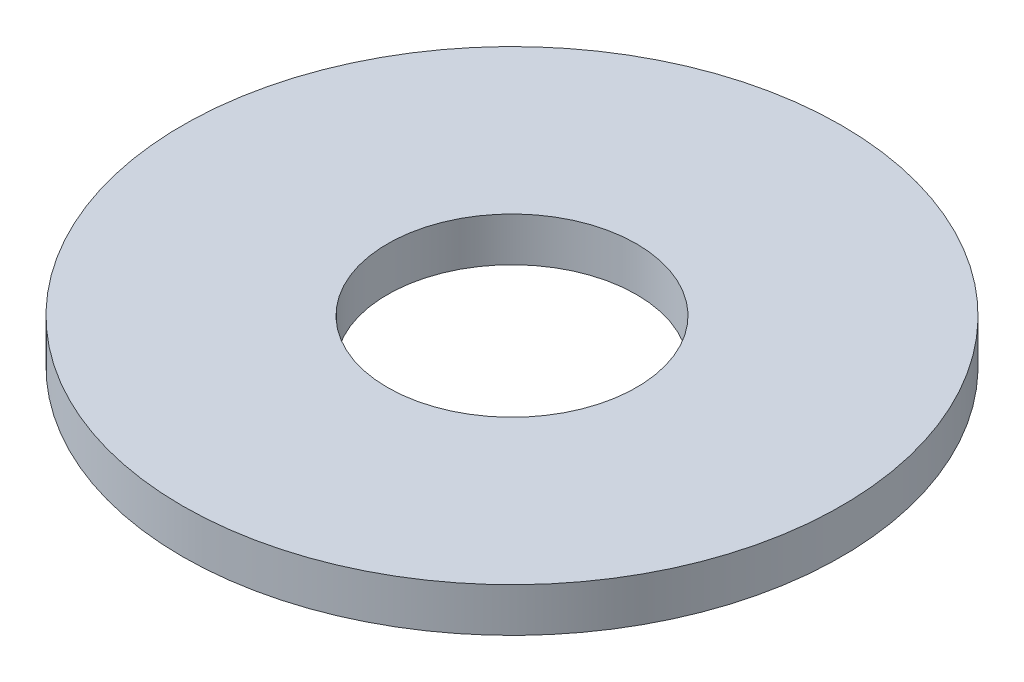
ISO-10303-21;
HEADER;
FILE_DESCRIPTION(('STEP AP214'),'2;1');
FILE_NAME('part.step','',(''),(''),'','','');
FILE_SCHEMA(('AUTOMOTIVE_DESIGN { 1 0 10303 214 1 1 1 1 }'));
ENDSEC;
DATA;
#1=APPLICATION_CONTEXT('core data for automotive mechanical design processes');
#2=APPLICATION_PROTOCOL_DEFINITION('international standard','automotive_design',2000,#1);
#3=PRODUCT_CONTEXT('',#1,'mechanical');
#4=PRODUCT('Part','Part','',(#3));
#5=PRODUCT_RELATED_PRODUCT_CATEGORY('part','',(#4));
#6=PRODUCT_DEFINITION_FORMATION('','',#4);
#7=PRODUCT_DEFINITION_CONTEXT('part definition',#1,'design');
#8=PRODUCT_DEFINITION('design','',#6,#7);
#9=PRODUCT_DEFINITION_SHAPE('','',#8);
#10=(LENGTH_UNIT() NAMED_UNIT(*) SI_UNIT(.MILLI.,.METRE.));
#11=(NAMED_UNIT(*) PLANE_ANGLE_UNIT() SI_UNIT($,.RADIAN.));
#12=(NAMED_UNIT(*) SI_UNIT($,.STERADIAN.) SOLID_ANGLE_UNIT());
#13=UNCERTAINTY_MEASURE_WITH_UNIT(LENGTH_MEASURE(1.E-05),#10,'distance_accuracy_value','');
#14=(GEOMETRIC_REPRESENTATION_CONTEXT(3) GLOBAL_UNCERTAINTY_ASSIGNED_CONTEXT((#13)) GLOBAL_UNIT_ASSIGNED_CONTEXT((#10,
#11,#12)) REPRESENTATION_CONTEXT('',''));
#15=CARTESIAN_POINT('',(0.,0.,0.));
#16=DIRECTION('',(0.,0.,1.));
#17=DIRECTION('',(1.,0.,0.));
#18=AXIS2_PLACEMENT_3D('',#15,#16,#17);
#19=CARTESIAN_POINT('',(0.,1.5,0.));
#20=DIRECTION('',(0.,1.,0.));
#21=DIRECTION('',(0.,0.,1.));
#22=AXIS2_PLACEMENT_3D('',#19,#20,#21);
#23=PLANE('',#22);
#24=CARTESIAN_POINT('',(0.,1.5,0.));
#25=DIRECTION('',(0.,1.,0.));
#26=DIRECTION('',(0.,0.,1.));
#27=AXIS2_PLACEMENT_3D('',#24,#25,#26);
#28=CIRCLE('',#27,11.25);
#29=CARTESIAN_POINT('',(0.,1.5,11.25));
#30=VERTEX_POINT('',#29);
#31=EDGE_CURVE('E10',#30,#30,#28,.T.);
#32=ORIENTED_EDGE('',*,*,#31,.T.);
#33=EDGE_LOOP('',(#32));
#34=FACE_BOUND('',#33,.T.);
#35=CARTESIAN_POINT('',(0.,1.5,0.));
#36=DIRECTION('',(0.,1.,0.));
#37=DIRECTION('',(0.,0.,1.));
#38=AXIS2_PLACEMENT_3D('',#35,#36,#37);
#39=CIRCLE('',#38,4.25);
#40=CARTESIAN_POINT('',(0.,1.5,4.25));
#41=VERTEX_POINT('',#40);
#42=EDGE_CURVE('E42',#41,#41,#39,.T.);
#43=ORIENTED_EDGE('',*,*,#42,.F.);
#44=EDGE_LOOP('',(#43));
#45=FACE_BOUND('',#44,.T.);
#46=ADVANCED_FACE('F31',(#34,#45),#23,.T.);
#47=CARTESIAN_POINT('',(0.,0.,0.));
#48=DIRECTION('',(0.,1.,0.));
#49=DIRECTION('',(0.,0.,1.));
#50=AXIS2_PLACEMENT_3D('',#47,#48,#49);
#51=PLANE('',#50);
#52=CARTESIAN_POINT('',(0.,0.,0.));
#53=DIRECTION('',(0.,1.,0.));
#54=DIRECTION('',(0.,0.,1.));
#55=AXIS2_PLACEMENT_3D('',#52,#53,#54);
#56=CIRCLE('',#55,11.25);
#57=CARTESIAN_POINT('',(0.,0.,11.25));
#58=VERTEX_POINT('',#57);
#59=EDGE_CURVE('E35',#58,#58,#56,.T.);
#60=ORIENTED_EDGE('',*,*,#59,.F.);
#61=EDGE_LOOP('',(#60));
#62=FACE_BOUND('',#61,.T.);
#63=CARTESIAN_POINT('',(0.,0.,0.));
#64=DIRECTION('',(0.,1.,0.));
#65=DIRECTION('',(0.,0.,1.));
#66=AXIS2_PLACEMENT_3D('',#63,#64,#65);
#67=CIRCLE('',#66,4.25);
#68=CARTESIAN_POINT('',(0.,0.,4.25));
#69=VERTEX_POINT('',#68);
#70=EDGE_CURVE('E44',#69,#69,#67,.T.);
#71=ORIENTED_EDGE('',*,*,#70,.T.);
#72=EDGE_LOOP('',(#71));
#73=FACE_BOUND('',#72,.T.);
#74=ADVANCED_FACE('F54',(#62,#73),#51,.F.);
#75=CARTESIAN_POINT('',(0.,1.5,0.));
#76=DIRECTION('',(0.,-1.,0.));
#77=DIRECTION('',(0.,0.,-1.));
#78=AXIS2_PLACEMENT_3D('',#75,#76,#77);
#79=CYLINDRICAL_SURFACE('',#78,11.25);
#80=ORIENTED_EDGE('',*,*,#31,.F.);
#81=EDGE_LOOP('',(#80));
#82=FACE_BOUND('',#81,.T.);
#83=ORIENTED_EDGE('',*,*,#59,.T.);
#84=EDGE_LOOP('',(#83));
#85=FACE_BOUND('',#84,.T.);
#86=ADVANCED_FACE('F33',(#82,#85),#79,.T.);
#87=CARTESIAN_POINT('',(0.,1.5,0.));
#88=DIRECTION('',(0.,-1.,0.));
#89=DIRECTION('',(0.,0.,-1.));
#90=AXIS2_PLACEMENT_3D('',#87,#88,#89);
#91=CYLINDRICAL_SURFACE('',#90,4.25);
#92=ORIENTED_EDGE('',*,*,#42,.T.);
#93=EDGE_LOOP('',(#92));
#94=FACE_BOUND('',#93,.T.);
#95=ORIENTED_EDGE('',*,*,#70,.F.);
#96=EDGE_LOOP('',(#95));
#97=FACE_BOUND('',#96,.T.);
#98=ADVANCED_FACE('F50',(#94,#97),#91,.F.);
#99=CLOSED_SHELL('',(#46,#74,#86,#98));
#100=MANIFOLD_SOLID_BREP('B2',#99);
#101=ADVANCED_BREP_SHAPE_REPRESENTATION('',(#18,#100),#14);
#102=SHAPE_DEFINITION_REPRESENTATION(#9,#101);
ENDSEC;
END-ISO-10303-21;
